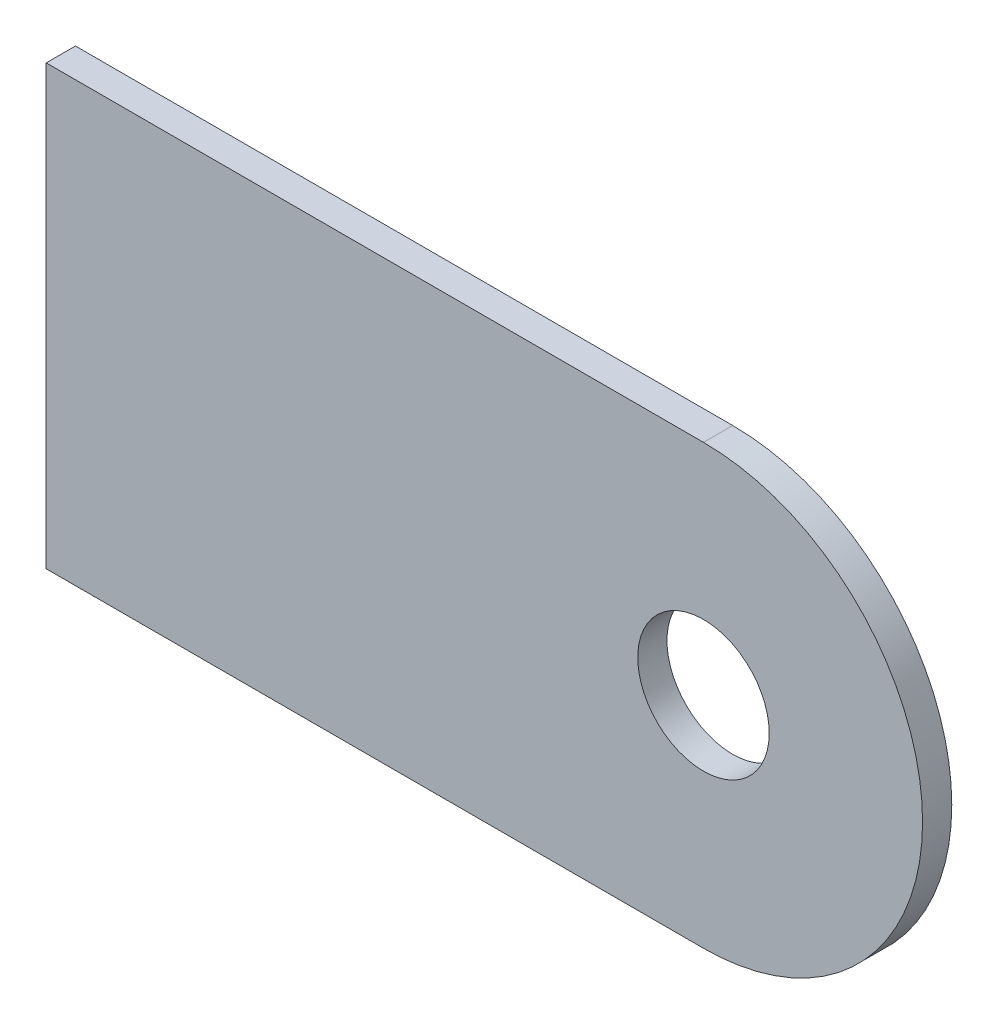
ISO-10303-21;
HEADER;
FILE_DESCRIPTION(('STEP AP214'),'2;1');
FILE_NAME('part.step','',(''),(''),'','','');
FILE_SCHEMA(('AUTOMOTIVE_DESIGN { 1 0 10303 214 1 1 1 1 }'));
ENDSEC;
DATA;
#1=APPLICATION_CONTEXT('core data for automotive mechanical design processes');
#2=APPLICATION_PROTOCOL_DEFINITION('international standard','automotive_design',2000,#1);
#3=PRODUCT_CONTEXT('',#1,'mechanical');
#4=PRODUCT('Part','Part','',(#3));
#5=PRODUCT_RELATED_PRODUCT_CATEGORY('part','',(#4));
#6=PRODUCT_DEFINITION_FORMATION('','',#4);
#7=PRODUCT_DEFINITION_CONTEXT('part definition',#1,'design');
#8=PRODUCT_DEFINITION('design','',#6,#7);
#9=PRODUCT_DEFINITION_SHAPE('','',#8);
#10=(LENGTH_UNIT() NAMED_UNIT(*) SI_UNIT(.MILLI.,.METRE.));
#11=(NAMED_UNIT(*) PLANE_ANGLE_UNIT() SI_UNIT($,.RADIAN.));
#12=(NAMED_UNIT(*) SI_UNIT($,.STERADIAN.) SOLID_ANGLE_UNIT());
#13=UNCERTAINTY_MEASURE_WITH_UNIT(LENGTH_MEASURE(1.E-05),#10,'distance_accuracy_value','');
#14=(GEOMETRIC_REPRESENTATION_CONTEXT(3) GLOBAL_UNCERTAINTY_ASSIGNED_CONTEXT((#13)) GLOBAL_UNIT_ASSIGNED_CONTEXT((#10,
#11,#12)) REPRESENTATION_CONTEXT('',''));
#15=CARTESIAN_POINT('',(0.,0.,0.));
#16=DIRECTION('',(0.,0.,1.));
#17=DIRECTION('',(1.,0.,0.));
#18=AXIS2_PLACEMENT_3D('',#15,#16,#17);
#19=CARTESIAN_POINT('',(0.,0.,4.));
#20=DIRECTION('',(0.,0.,1.));
#21=DIRECTION('',(1.,0.,0.));
#22=AXIS2_PLACEMENT_3D('',#19,#20,#21);
#23=PLANE('',#22);
#24=CARTESIAN_POINT('',(0.,0.,4.));
#25=DIRECTION('',(0.,0.,1.));
#26=DIRECTION('',(1.,0.,0.));
#27=AXIS2_PLACEMENT_3D('',#24,#25,#26);
#28=CIRCLE('',#27,30.);
#29=CARTESIAN_POINT('',(0.,-30.,4.));
#30=VERTEX_POINT('',#29);
#31=CARTESIAN_POINT('',(0.,30.,4.));
#32=VERTEX_POINT('',#31);
#33=EDGE_CURVE('E96',#30,#32,#28,.T.);
#34=ORIENTED_EDGE('',*,*,#33,.T.);
#35=DIRECTION('',(-1.,0.,0.));
#36=VECTOR('',#35,1.);
#37=CARTESIAN_POINT('',(0.,30.,4.));
#38=LINE('',#37,#36);
#39=CARTESIAN_POINT('',(-90.,30.,4.));
#40=VERTEX_POINT('',#39);
#41=EDGE_CURVE('E91',#32,#40,#38,.T.);
#42=ORIENTED_EDGE('',*,*,#41,.T.);
#43=DIRECTION('',(0.,-1.,0.));
#44=VECTOR('',#43,1.);
#45=CARTESIAN_POINT('',(-90.,30.,4.));
#46=LINE('',#45,#44);
#47=CARTESIAN_POINT('',(-90.,-30.,4.));
#48=VERTEX_POINT('',#47);
#49=EDGE_CURVE('E94',#40,#48,#46,.T.);
#50=ORIENTED_EDGE('',*,*,#49,.T.);
#51=DIRECTION('',(1.,0.,0.));
#52=VECTOR('',#51,1.);
#53=CARTESIAN_POINT('',(0.,-30.,4.));
#54=LINE('',#53,#52);
#55=EDGE_CURVE('E61',#48,#30,#54,.T.);
#56=ORIENTED_EDGE('',*,*,#55,.T.);
#57=EDGE_LOOP('',(#34,#42,#50,#56));
#58=FACE_BOUND('',#57,.T.);
#59=CARTESIAN_POINT('',(0.,0.,4.));
#60=DIRECTION('',(0.,0.,1.));
#61=DIRECTION('',(1.,0.,0.));
#62=AXIS2_PLACEMENT_3D('',#59,#60,#61);
#63=CIRCLE('',#62,9.);
#64=CARTESIAN_POINT('',(9.,0.,4.));
#65=VERTEX_POINT('',#64);
#66=EDGE_CURVE('E116',#65,#65,#63,.T.);
#67=ORIENTED_EDGE('',*,*,#66,.F.);
#68=EDGE_LOOP('',(#67));
#69=FACE_BOUND('',#68,.T.);
#70=ADVANCED_FACE('F43',(#58,#69),#23,.T.);
#71=CARTESIAN_POINT('',(0.,0.,0.));
#72=DIRECTION('',(0.,0.,1.));
#73=DIRECTION('',(1.,0.,0.));
#74=AXIS2_PLACEMENT_3D('',#71,#72,#73);
#75=PLANE('',#74);
#76=CARTESIAN_POINT('',(0.,0.,0.));
#77=DIRECTION('',(0.,0.,1.));
#78=DIRECTION('',(1.,0.,0.));
#79=AXIS2_PLACEMENT_3D('',#76,#77,#78);
#80=CIRCLE('',#79,30.);
#81=CARTESIAN_POINT('',(0.,-30.,0.));
#82=VERTEX_POINT('',#81);
#83=CARTESIAN_POINT('',(0.,30.,0.));
#84=VERTEX_POINT('',#83);
#85=EDGE_CURVE('E112',#82,#84,#80,.T.);
#86=ORIENTED_EDGE('',*,*,#85,.F.);
#87=DIRECTION('',(1.,0.,0.));
#88=VECTOR('',#87,1.);
#89=CARTESIAN_POINT('',(0.,-30.,0.));
#90=LINE('',#89,#88);
#91=CARTESIAN_POINT('',(-90.,-30.,0.));
#92=VERTEX_POINT('',#91);
#93=EDGE_CURVE('E84',#92,#82,#90,.T.);
#94=ORIENTED_EDGE('',*,*,#93,.F.);
#95=DIRECTION('',(0.,-1.,0.));
#96=VECTOR('',#95,1.);
#97=CARTESIAN_POINT('',(-90.,30.,0.));
#98=LINE('',#97,#96);
#99=CARTESIAN_POINT('',(-90.,30.,0.));
#100=VERTEX_POINT('',#99);
#101=EDGE_CURVE('E78',#100,#92,#98,.T.);
#102=ORIENTED_EDGE('',*,*,#101,.F.);
#103=DIRECTION('',(-1.,0.,0.));
#104=VECTOR('',#103,1.);
#105=CARTESIAN_POINT('',(0.,30.,0.));
#106=LINE('',#105,#104);
#107=EDGE_CURVE('E101',#84,#100,#106,.T.);
#108=ORIENTED_EDGE('',*,*,#107,.F.);
#109=EDGE_LOOP('',(#86,#94,#102,#108));
#110=FACE_BOUND('',#109,.T.);
#111=CARTESIAN_POINT('',(0.,0.,0.));
#112=DIRECTION('',(0.,0.,1.));
#113=DIRECTION('',(1.,0.,0.));
#114=AXIS2_PLACEMENT_3D('',#111,#112,#113);
#115=CIRCLE('',#114,9.);
#116=CARTESIAN_POINT('',(9.,0.,0.));
#117=VERTEX_POINT('',#116);
#118=EDGE_CURVE('E134',#117,#117,#115,.T.);
#119=ORIENTED_EDGE('',*,*,#118,.T.);
#120=EDGE_LOOP('',(#119));
#121=FACE_BOUND('',#120,.T.);
#122=ADVANCED_FACE('F129',(#110,#121),#75,.F.);
#123=CARTESIAN_POINT('',(0.,0.,4.));
#124=DIRECTION('',(0.,0.,-1.));
#125=DIRECTION('',(-1.,0.,0.));
#126=AXIS2_PLACEMENT_3D('',#123,#124,#125);
#127=CYLINDRICAL_SURFACE('',#126,30.);
#128=ORIENTED_EDGE('',*,*,#85,.T.);
#129=DIRECTION('',(0.,0.,-1.));
#130=VECTOR('',#129,1.);
#131=CARTESIAN_POINT('',(0.,30.,4.));
#132=LINE('',#131,#130);
#133=EDGE_CURVE('E11',#32,#84,#132,.T.);
#134=ORIENTED_EDGE('',*,*,#133,.F.);
#135=ORIENTED_EDGE('',*,*,#33,.F.);
#136=DIRECTION('',(0.,0.,-1.));
#137=VECTOR('',#136,1.);
#138=CARTESIAN_POINT('',(0.,-30.,4.));
#139=LINE('',#138,#137);
#140=EDGE_CURVE('E108',#30,#82,#139,.T.);
#141=ORIENTED_EDGE('',*,*,#140,.T.);
#142=EDGE_LOOP('',(#128,#134,#135,#141));
#143=FACE_BOUND('',#142,.T.);
#144=ADVANCED_FACE('F45',(#143),#127,.T.);
#145=CARTESIAN_POINT('',(0.,30.,4.));
#146=DIRECTION('',(0.,-1.,0.));
#147=DIRECTION('',(1.,0.,0.));
#148=AXIS2_PLACEMENT_3D('',#145,#146,#147);
#149=PLANE('',#148);
#150=ORIENTED_EDGE('',*,*,#107,.T.);
#151=DIRECTION('',(0.,0.,-1.));
#152=VECTOR('',#151,1.);
#153=CARTESIAN_POINT('',(-90.,30.,4.));
#154=LINE('',#153,#152);
#155=EDGE_CURVE('E53',#40,#100,#154,.T.);
#156=ORIENTED_EDGE('',*,*,#155,.F.);
#157=ORIENTED_EDGE('',*,*,#41,.F.);
#158=ORIENTED_EDGE('',*,*,#133,.T.);
#159=EDGE_LOOP('',(#150,#156,#157,#158));
#160=FACE_BOUND('',#159,.T.);
#161=ADVANCED_FACE('F100',(#160),#149,.F.);
#162=CARTESIAN_POINT('',(-90.,30.,4.));
#163=DIRECTION('',(1.,0.,0.));
#164=DIRECTION('',(0.,0.,-1.));
#165=AXIS2_PLACEMENT_3D('',#162,#163,#164);
#166=PLANE('',#165);
#167=ORIENTED_EDGE('',*,*,#101,.T.);
#168=DIRECTION('',(0.,0.,-1.));
#169=VECTOR('',#168,1.);
#170=CARTESIAN_POINT('',(-90.,-30.,4.));
#171=LINE('',#170,#169);
#172=EDGE_CURVE('E103',#48,#92,#171,.T.);
#173=ORIENTED_EDGE('',*,*,#172,.F.);
#174=ORIENTED_EDGE('',*,*,#49,.F.);
#175=ORIENTED_EDGE('',*,*,#155,.T.);
#176=EDGE_LOOP('',(#167,#173,#174,#175));
#177=FACE_BOUND('',#176,.T.);
#178=ADVANCED_FACE('F104',(#177),#166,.F.);
#179=CARTESIAN_POINT('',(0.,-30.,4.));
#180=DIRECTION('',(0.,1.,0.));
#181=DIRECTION('',(-1.,0.,0.));
#182=AXIS2_PLACEMENT_3D('',#179,#180,#181);
#183=PLANE('',#182);
#184=ORIENTED_EDGE('',*,*,#93,.T.);
#185=ORIENTED_EDGE('',*,*,#140,.F.);
#186=ORIENTED_EDGE('',*,*,#55,.F.);
#187=ORIENTED_EDGE('',*,*,#172,.T.);
#188=EDGE_LOOP('',(#184,#185,#186,#187));
#189=FACE_BOUND('',#188,.T.);
#190=ADVANCED_FACE('F126',(#189),#183,.F.);
#191=CARTESIAN_POINT('',(0.,0.,4.));
#192=DIRECTION('',(0.,0.,-1.));
#193=DIRECTION('',(-1.,0.,0.));
#194=AXIS2_PLACEMENT_3D('',#191,#192,#193);
#195=CYLINDRICAL_SURFACE('',#194,9.);
#196=ORIENTED_EDGE('',*,*,#66,.T.);
#197=EDGE_LOOP('',(#196));
#198=FACE_BOUND('',#197,.T.);
#199=ORIENTED_EDGE('',*,*,#118,.F.);
#200=EDGE_LOOP('',(#199));
#201=FACE_BOUND('',#200,.T.);
#202=ADVANCED_FACE('F142',(#198,#201),#195,.F.);
#203=CLOSED_SHELL('',(#70,#122,#144,#161,#178,#190,#202));
#204=MANIFOLD_SOLID_BREP('B2',#203);
#205=ADVANCED_BREP_SHAPE_REPRESENTATION('',(#18,#204),#14);
#206=SHAPE_DEFINITION_REPRESENTATION(#9,#205);
ENDSEC;
END-ISO-10303-21;
